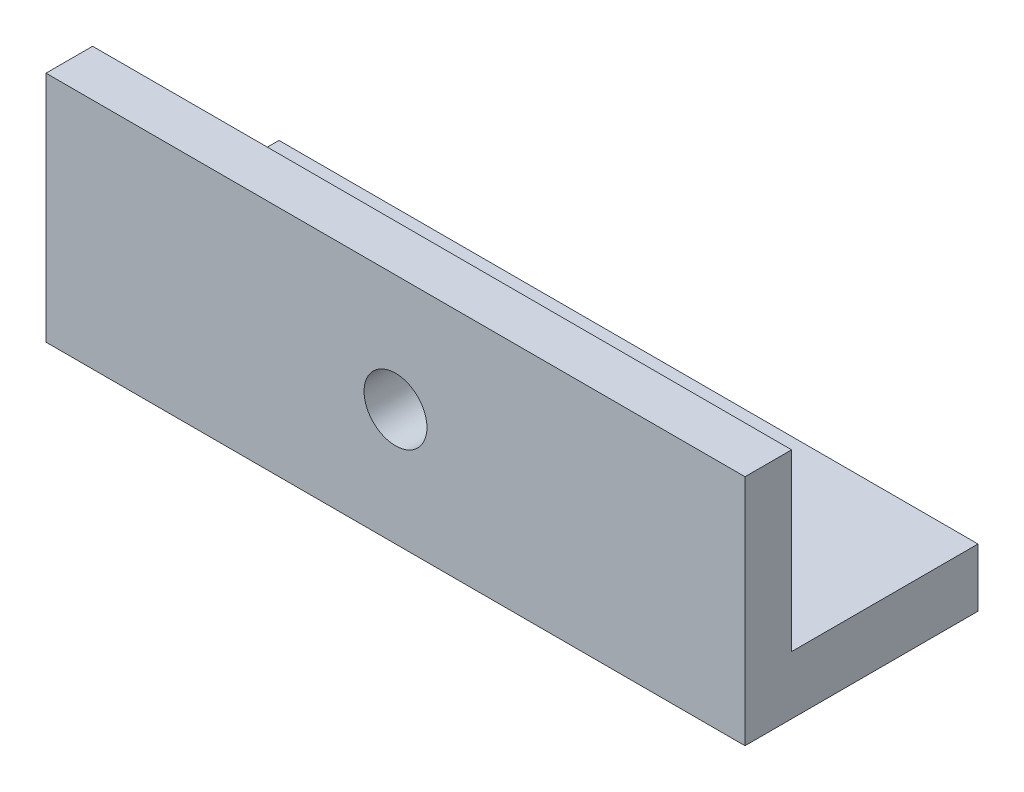
ISO-10303-21;
HEADER;
FILE_DESCRIPTION(('STEP AP214'),'2;1');
FILE_NAME('part.step','',(''),(''),'','','');
FILE_SCHEMA(('AUTOMOTIVE_DESIGN { 1 0 10303 214 1 1 1 1 }'));
ENDSEC;
DATA;
#1=APPLICATION_CONTEXT('core data for automotive mechanical design processes');
#2=APPLICATION_PROTOCOL_DEFINITION('international standard','automotive_design',2000,#1);
#3=PRODUCT_CONTEXT('',#1,'mechanical');
#4=PRODUCT('Part','Part','',(#3));
#5=PRODUCT_RELATED_PRODUCT_CATEGORY('part','',(#4));
#6=PRODUCT_DEFINITION_FORMATION('','',#4);
#7=PRODUCT_DEFINITION_CONTEXT('part definition',#1,'design');
#8=PRODUCT_DEFINITION('design','',#6,#7);
#9=PRODUCT_DEFINITION_SHAPE('','',#8);
#10=(LENGTH_UNIT() NAMED_UNIT(*) SI_UNIT(.MILLI.,.METRE.));
#11=(NAMED_UNIT(*) PLANE_ANGLE_UNIT() SI_UNIT($,.RADIAN.));
#12=(NAMED_UNIT(*) SI_UNIT($,.STERADIAN.) SOLID_ANGLE_UNIT());
#13=UNCERTAINTY_MEASURE_WITH_UNIT(LENGTH_MEASURE(1.E-05),#10,'distance_accuracy_value','');
#14=(GEOMETRIC_REPRESENTATION_CONTEXT(3) GLOBAL_UNCERTAINTY_ASSIGNED_CONTEXT((#13)) GLOBAL_UNIT_ASSIGNED_CONTEXT((#10,
#11,#12)) REPRESENTATION_CONTEXT('',''));
#15=CARTESIAN_POINT('',(0.,0.,0.));
#16=DIRECTION('',(0.,0.,1.));
#17=DIRECTION('',(1.,0.,0.));
#18=AXIS2_PLACEMENT_3D('',#15,#16,#17);
#19=CARTESIAN_POINT('',(0.,6.35,0.));
#20=DIRECTION('',(0.,-1.,0.));
#21=DIRECTION('',(0.,0.,-1.));
#22=AXIS2_PLACEMENT_3D('',#19,#20,#21);
#23=PLANE('',#22);
#24=CARTESIAN_POINT('',(12.7,6.35,-12.7));
#25=DIRECTION('',(0.,1.,0.));
#26=DIRECTION('',(0.,0.,1.));
#27=AXIS2_PLACEMENT_3D('',#24,#25,#26);
#28=CIRCLE('',#27,2.794);
#29=CARTESIAN_POINT('',(12.7,6.35,-9.906));
#30=VERTEX_POINT('',#29);
#31=EDGE_CURVE('E165',#30,#30,#28,.T.);
#32=ORIENTED_EDGE('',*,*,#31,.F.);
#33=EDGE_LOOP('',(#32));
#34=FACE_BOUND('',#33,.T.);
#35=CARTESIAN_POINT('',(63.5,6.35,-12.7));
#36=DIRECTION('',(0.,1.,0.));
#37=DIRECTION('',(0.,0.,1.));
#38=AXIS2_PLACEMENT_3D('',#35,#36,#37);
#39=CIRCLE('',#38,2.79400000000001);
#40=CARTESIAN_POINT('',(63.5,6.35,-9.90599999999999));
#41=VERTEX_POINT('',#40);
#42=EDGE_CURVE('E105',#41,#41,#39,.T.);
#43=ORIENTED_EDGE('',*,*,#42,.F.);
#44=EDGE_LOOP('',(#43));
#45=FACE_BOUND('',#44,.T.);
#46=DIRECTION('',(-1.,0.,0.));
#47=VECTOR('',#46,1.);
#48=CARTESIAN_POINT('',(0.,6.35,-5.08));
#49=LINE('',#48,#47);
#50=CARTESIAN_POINT('',(76.2,6.35,-5.08));
#51=VERTEX_POINT('',#50);
#52=CARTESIAN_POINT('',(0.,6.35,-5.08));
#53=VERTEX_POINT('',#52);
#54=EDGE_CURVE('E55',#51,#53,#49,.T.);
#55=ORIENTED_EDGE('',*,*,#54,.F.);
#56=DIRECTION('',(0.,0.,-1.));
#57=VECTOR('',#56,1.);
#58=CARTESIAN_POINT('',(76.2,6.35,0.));
#59=LINE('',#58,#57);
#60=CARTESIAN_POINT('',(76.2,6.35,-25.4));
#61=VERTEX_POINT('',#60);
#62=EDGE_CURVE('E176',#51,#61,#59,.T.);
#63=ORIENTED_EDGE('',*,*,#62,.T.);
#64=DIRECTION('',(-1.,0.,0.));
#65=VECTOR('',#64,1.);
#66=CARTESIAN_POINT('',(0.,6.35,-25.4));
#67=LINE('',#66,#65);
#68=CARTESIAN_POINT('',(0.,6.35,-25.4));
#69=VERTEX_POINT('',#68);
#70=EDGE_CURVE('E61',#61,#69,#67,.T.);
#71=ORIENTED_EDGE('',*,*,#70,.T.);
#72=DIRECTION('',(0.,0.,1.));
#73=VECTOR('',#72,1.);
#74=CARTESIAN_POINT('',(0.,6.35,0.));
#75=LINE('',#74,#73);
#76=EDGE_CURVE('E91',#69,#53,#75,.T.);
#77=ORIENTED_EDGE('',*,*,#76,.T.);
#78=EDGE_LOOP('',(#55,#63,#71,#77));
#79=FACE_BOUND('',#78,.T.);
#80=ADVANCED_FACE('F39',(#34,#45,#79),#23,.F.);
#81=CARTESIAN_POINT('',(0.,0.,0.));
#82=DIRECTION('',(0.,-1.,0.));
#83=DIRECTION('',(0.,0.,-1.));
#84=AXIS2_PLACEMENT_3D('',#81,#82,#83);
#85=PLANE('',#84);
#86=CARTESIAN_POINT('',(63.5,0.,-12.7));
#87=DIRECTION('',(0.,1.,0.));
#88=DIRECTION('',(0.,0.,1.));
#89=AXIS2_PLACEMENT_3D('',#86,#87,#88);
#90=CIRCLE('',#89,2.79400000000001);
#91=CARTESIAN_POINT('',(63.5,0.,-9.90599999999999));
#92=VERTEX_POINT('',#91);
#93=EDGE_CURVE('E111',#92,#92,#90,.T.);
#94=ORIENTED_EDGE('',*,*,#93,.T.);
#95=EDGE_LOOP('',(#94));
#96=FACE_BOUND('',#95,.T.);
#97=DIRECTION('',(0.,0.,1.));
#98=VECTOR('',#97,1.);
#99=CARTESIAN_POINT('',(0.,0.,0.));
#100=LINE('',#99,#98);
#101=CARTESIAN_POINT('',(0.,0.,-25.4));
#102=VERTEX_POINT('',#101);
#103=CARTESIAN_POINT('',(0.,0.,0.));
#104=VERTEX_POINT('',#103);
#105=EDGE_CURVE('E97',#102,#104,#100,.T.);
#106=ORIENTED_EDGE('',*,*,#105,.F.);
#107=DIRECTION('',(-1.,0.,0.));
#108=VECTOR('',#107,1.);
#109=CARTESIAN_POINT('',(0.,0.,-25.4));
#110=LINE('',#109,#108);
#111=CARTESIAN_POINT('',(76.2,0.,-25.4));
#112=VERTEX_POINT('',#111);
#113=EDGE_CURVE('E80',#112,#102,#110,.T.);
#114=ORIENTED_EDGE('',*,*,#113,.F.);
#115=DIRECTION('',(0.,0.,-1.));
#116=VECTOR('',#115,1.);
#117=CARTESIAN_POINT('',(76.2,0.,0.));
#118=LINE('',#117,#116);
#119=CARTESIAN_POINT('',(76.2,0.,0.));
#120=VERTEX_POINT('',#119);
#121=EDGE_CURVE('E92',#120,#112,#118,.T.);
#122=ORIENTED_EDGE('',*,*,#121,.F.);
#123=DIRECTION('',(1.,0.,0.));
#124=VECTOR('',#123,1.);
#125=CARTESIAN_POINT('',(0.,0.,0.));
#126=LINE('',#125,#124);
#127=EDGE_CURVE('E103',#104,#120,#126,.T.);
#128=ORIENTED_EDGE('',*,*,#127,.F.);
#129=EDGE_LOOP('',(#106,#114,#122,#128));
#130=FACE_BOUND('',#129,.T.);
#131=CARTESIAN_POINT('',(12.7,0.,-12.7));
#132=DIRECTION('',(0.,1.,0.));
#133=DIRECTION('',(0.,0.,1.));
#134=AXIS2_PLACEMENT_3D('',#131,#132,#133);
#135=CIRCLE('',#134,2.794);
#136=CARTESIAN_POINT('',(12.7,0.,-9.906));
#137=VERTEX_POINT('',#136);
#138=EDGE_CURVE('E164',#137,#137,#135,.T.);
#139=ORIENTED_EDGE('',*,*,#138,.T.);
#140=EDGE_LOOP('',(#139));
#141=FACE_BOUND('',#140,.T.);
#142=ADVANCED_FACE('F101',(#96,#130,#141),#85,.T.);
#143=CARTESIAN_POINT('',(0.,6.35,0.));
#144=DIRECTION('',(1.,0.,0.));
#145=DIRECTION('',(0.,0.,-1.));
#146=AXIS2_PLACEMENT_3D('',#143,#144,#145);
#147=PLANE('',#146);
#148=ORIENTED_EDGE('',*,*,#105,.T.);
#149=DIRECTION('',(0.,-1.,0.));
#150=VECTOR('',#149,1.);
#151=CARTESIAN_POINT('',(0.,6.35,0.));
#152=LINE('',#151,#150);
#153=CARTESIAN_POINT('',(0.,25.4,0.));
#154=VERTEX_POINT('',#153);
#155=EDGE_CURVE('E11',#154,#104,#152,.T.);
#156=ORIENTED_EDGE('',*,*,#155,.F.);
#157=DIRECTION('',(0.,0.,1.));
#158=VECTOR('',#157,1.);
#159=CARTESIAN_POINT('',(0.,25.4,0.));
#160=LINE('',#159,#158);
#161=CARTESIAN_POINT('',(0.,25.4,-5.08));
#162=VERTEX_POINT('',#161);
#163=EDGE_CURVE('E142',#162,#154,#160,.T.);
#164=ORIENTED_EDGE('',*,*,#163,.F.);
#165=DIRECTION('',(0.,-1.,0.));
#166=VECTOR('',#165,1.);
#167=CARTESIAN_POINT('',(0.,25.4,-5.08));
#168=LINE('',#167,#166);
#169=EDGE_CURVE('E154',#162,#53,#168,.T.);
#170=ORIENTED_EDGE('',*,*,#169,.T.);
#171=ORIENTED_EDGE('',*,*,#76,.F.);
#172=DIRECTION('',(0.,-1.,0.));
#173=VECTOR('',#172,1.);
#174=CARTESIAN_POINT('',(0.,6.35,-25.4));
#175=LINE('',#174,#173);
#176=EDGE_CURVE('E83',#69,#102,#175,.T.);
#177=ORIENTED_EDGE('',*,*,#176,.T.);
#178=EDGE_LOOP('',(#148,#156,#164,#170,#171,#177));
#179=FACE_BOUND('',#178,.T.);
#180=ADVANCED_FACE('F41',(#179),#147,.F.);
#181=CARTESIAN_POINT('',(0.,6.35,0.));
#182=DIRECTION('',(0.,0.,-1.));
#183=DIRECTION('',(-1.,0.,0.));
#184=AXIS2_PLACEMENT_3D('',#181,#182,#183);
#185=PLANE('',#184);
#186=CARTESIAN_POINT('',(38.1,12.7,0.));
#187=DIRECTION('',(0.,0.,1.));
#188=DIRECTION('',(1.,0.,0.));
#189=AXIS2_PLACEMENT_3D('',#186,#187,#188);
#190=CIRCLE('',#189,3.429);
#191=CARTESIAN_POINT('',(41.529,12.7,0.));
#192=VERTEX_POINT('',#191);
#193=EDGE_CURVE('E225',#192,#192,#190,.T.);
#194=ORIENTED_EDGE('',*,*,#193,.F.);
#195=EDGE_LOOP('',(#194));
#196=FACE_BOUND('',#195,.T.);
#197=ORIENTED_EDGE('',*,*,#127,.T.);
#198=DIRECTION('',(0.,-1.,0.));
#199=VECTOR('',#198,1.);
#200=CARTESIAN_POINT('',(76.2,6.35,0.));
#201=LINE('',#200,#199);
#202=CARTESIAN_POINT('',(76.2,25.4,0.));
#203=VERTEX_POINT('',#202);
#204=EDGE_CURVE('E48',#203,#120,#201,.T.);
#205=ORIENTED_EDGE('',*,*,#204,.F.);
#206=DIRECTION('',(1.,0.,0.));
#207=VECTOR('',#206,1.);
#208=CARTESIAN_POINT('',(0.,25.4,0.));
#209=LINE('',#208,#207);
#210=EDGE_CURVE('E134',#154,#203,#209,.T.);
#211=ORIENTED_EDGE('',*,*,#210,.F.);
#212=ORIENTED_EDGE('',*,*,#155,.T.);
#213=EDGE_LOOP('',(#197,#205,#211,#212));
#214=FACE_BOUND('',#213,.T.);
#215=ADVANCED_FACE('F132',(#196,#214),#185,.F.);
#216=CARTESIAN_POINT('',(76.2,6.35,0.));
#217=DIRECTION('',(-1.,0.,0.));
#218=DIRECTION('',(0.,0.,1.));
#219=AXIS2_PLACEMENT_3D('',#216,#217,#218);
#220=PLANE('',#219);
#221=ORIENTED_EDGE('',*,*,#121,.T.);
#222=DIRECTION('',(0.,-1.,0.));
#223=VECTOR('',#222,1.);
#224=CARTESIAN_POINT('',(76.2,6.35,-25.4));
#225=LINE('',#224,#223);
#226=EDGE_CURVE('E86',#61,#112,#225,.T.);
#227=ORIENTED_EDGE('',*,*,#226,.F.);
#228=ORIENTED_EDGE('',*,*,#62,.F.);
#229=DIRECTION('',(0.,-1.,0.));
#230=VECTOR('',#229,1.);
#231=CARTESIAN_POINT('',(76.2,25.4,-5.08));
#232=LINE('',#231,#230);
#233=CARTESIAN_POINT('',(76.2,25.4,-5.08));
#234=VERTEX_POINT('',#233);
#235=EDGE_CURVE('E160',#234,#51,#232,.T.);
#236=ORIENTED_EDGE('',*,*,#235,.F.);
#237=DIRECTION('',(0.,0.,-1.));
#238=VECTOR('',#237,1.);
#239=CARTESIAN_POINT('',(76.2,25.4,0.));
#240=LINE('',#239,#238);
#241=EDGE_CURVE('E128',#203,#234,#240,.T.);
#242=ORIENTED_EDGE('',*,*,#241,.F.);
#243=ORIENTED_EDGE('',*,*,#204,.T.);
#244=EDGE_LOOP('',(#221,#227,#228,#236,#242,#243));
#245=FACE_BOUND('',#244,.T.);
#246=ADVANCED_FACE('F124',(#245),#220,.F.);
#247=CARTESIAN_POINT('',(0.,6.35,-25.4));
#248=DIRECTION('',(0.,0.,1.));
#249=DIRECTION('',(1.,0.,0.));
#250=AXIS2_PLACEMENT_3D('',#247,#248,#249);
#251=PLANE('',#250);
#252=ORIENTED_EDGE('',*,*,#113,.T.);
#253=ORIENTED_EDGE('',*,*,#176,.F.);
#254=ORIENTED_EDGE('',*,*,#70,.F.);
#255=ORIENTED_EDGE('',*,*,#226,.T.);
#256=EDGE_LOOP('',(#252,#253,#254,#255));
#257=FACE_BOUND('',#256,.T.);
#258=ADVANCED_FACE('F82',(#257),#251,.F.);
#259=CARTESIAN_POINT('',(63.5,6.35,-12.7));
#260=DIRECTION('',(0.,-1.,0.));
#261=DIRECTION('',(0.,0.,-1.));
#262=AXIS2_PLACEMENT_3D('',#259,#260,#261);
#263=CYLINDRICAL_SURFACE('',#262,2.79400000000001);
#264=ORIENTED_EDGE('',*,*,#42,.T.);
#265=EDGE_LOOP('',(#264));
#266=FACE_BOUND('',#265,.T.);
#267=ORIENTED_EDGE('',*,*,#93,.F.);
#268=EDGE_LOOP('',(#267));
#269=FACE_BOUND('',#268,.T.);
#270=ADVANCED_FACE('F198',(#266,#269),#263,.F.);
#271=CARTESIAN_POINT('',(12.7,6.35,-12.7));
#272=DIRECTION('',(0.,-1.,0.));
#273=DIRECTION('',(0.,0.,-1.));
#274=AXIS2_PLACEMENT_3D('',#271,#272,#273);
#275=CYLINDRICAL_SURFACE('',#274,2.794);
#276=ORIENTED_EDGE('',*,*,#31,.T.);
#277=EDGE_LOOP('',(#276));
#278=FACE_BOUND('',#277,.T.);
#279=ORIENTED_EDGE('',*,*,#138,.F.);
#280=EDGE_LOOP('',(#279));
#281=FACE_BOUND('',#280,.T.);
#282=ADVANCED_FACE('F188',(#278,#281),#275,.F.);
#283=CARTESIAN_POINT('',(0.,25.4,-5.08));
#284=DIRECTION('',(0.,0.,1.));
#285=DIRECTION('',(1.,0.,0.));
#286=AXIS2_PLACEMENT_3D('',#283,#284,#285);
#287=PLANE('',#286);
#288=CARTESIAN_POINT('',(38.1,12.7,-5.08));
#289=DIRECTION('',(0.,0.,1.));
#290=DIRECTION('',(1.,0.,0.));
#291=AXIS2_PLACEMENT_3D('',#288,#289,#290);
#292=CIRCLE('',#291,3.429);
#293=CARTESIAN_POINT('',(41.529,12.7,-5.08));
#294=VERTEX_POINT('',#293);
#295=EDGE_CURVE('E157',#294,#294,#292,.F.);
#296=ORIENTED_EDGE('',*,*,#295,.F.);
#297=EDGE_LOOP('',(#296));
#298=FACE_BOUND('',#297,.T.);
#299=ORIENTED_EDGE('',*,*,#54,.T.);
#300=ORIENTED_EDGE('',*,*,#169,.F.);
#301=DIRECTION('',(-1.,0.,0.));
#302=VECTOR('',#301,1.);
#303=CARTESIAN_POINT('',(0.,25.4,-5.08));
#304=LINE('',#303,#302);
#305=EDGE_CURVE('E147',#234,#162,#304,.T.);
#306=ORIENTED_EDGE('',*,*,#305,.F.);
#307=ORIENTED_EDGE('',*,*,#235,.T.);
#308=EDGE_LOOP('',(#299,#300,#306,#307));
#309=FACE_BOUND('',#308,.T.);
#310=ADVANCED_FACE('F181',(#298,#309),#287,.F.);
#311=CARTESIAN_POINT('',(0.,25.4,0.));
#312=DIRECTION('',(0.,-1.,0.));
#313=DIRECTION('',(0.,0.,-1.));
#314=AXIS2_PLACEMENT_3D('',#311,#312,#313);
#315=PLANE('',#314);
#316=ORIENTED_EDGE('',*,*,#163,.T.);
#317=ORIENTED_EDGE('',*,*,#210,.T.);
#318=ORIENTED_EDGE('',*,*,#241,.T.);
#319=ORIENTED_EDGE('',*,*,#305,.T.);
#320=EDGE_LOOP('',(#316,#317,#318,#319));
#321=FACE_BOUND('',#320,.T.);
#322=ADVANCED_FACE('F139',(#321),#315,.F.);
#323=CARTESIAN_POINT('',(38.1,12.7,-14.7786766107547));
#324=DIRECTION('',(0.,0.,1.));
#325=DIRECTION('',(1.,0.,0.));
#326=AXIS2_PLACEMENT_3D('',#323,#324,#325);
#327=CYLINDRICAL_SURFACE('',#326,3.429);
#328=CARTESIAN_POINT('',(41.529,12.7,-5.08));
#329=CARTESIAN_POINT('',(41.529,12.7,-5.02708333333334));
#330=CARTESIAN_POINT('',(41.529,12.7,-4.97416666666667));
#331=CARTESIAN_POINT('',(41.529,12.7,-4.86833333333334));
#332=CARTESIAN_POINT('',(41.529,12.7,-4.81541666666667));
#333=CARTESIAN_POINT('',(41.529,12.7,-4.70958333333334));
#334=CARTESIAN_POINT('',(41.529,12.7,-4.65666666666667));
#335=CARTESIAN_POINT('',(41.529,12.7,-4.55083333333334));
#336=CARTESIAN_POINT('',(41.529,12.7,-4.49791666666667));
#337=CARTESIAN_POINT('',(41.529,12.7,-4.39208333333334));
#338=CARTESIAN_POINT('',(41.529,12.7,-4.33916666666667));
#339=CARTESIAN_POINT('',(41.529,12.7,-4.23333333333334));
#340=CARTESIAN_POINT('',(41.529,12.7,-4.18041666666667));
#341=CARTESIAN_POINT('',(41.529,12.7,-4.07458333333334));
#342=CARTESIAN_POINT('',(41.529,12.7,-4.02166666666667));
#343=CARTESIAN_POINT('',(41.529,12.7,-3.91583333333334));
#344=CARTESIAN_POINT('',(41.529,12.7,-3.86291666666667));
#345=CARTESIAN_POINT('',(41.529,12.7,-3.75708333333334));
#346=CARTESIAN_POINT('',(41.529,12.7,-3.70416666666667));
#347=CARTESIAN_POINT('',(41.529,12.7,-3.59833333333334));
#348=CARTESIAN_POINT('',(41.529,12.7,-3.54541666666667));
#349=CARTESIAN_POINT('',(41.529,12.7,-3.43958333333334));
#350=CARTESIAN_POINT('',(41.529,12.7,-3.38666666666667));
#351=CARTESIAN_POINT('',(41.529,12.7,-3.28083333333334));
#352=CARTESIAN_POINT('',(41.529,12.7,-3.22791666666667));
#353=CARTESIAN_POINT('',(41.529,12.7,-3.12208333333334));
#354=CARTESIAN_POINT('',(41.529,12.7,-3.06916666666667));
#355=CARTESIAN_POINT('',(41.529,12.7,-2.96333333333334));
#356=CARTESIAN_POINT('',(41.529,12.7,-2.91041666666667));
#357=CARTESIAN_POINT('',(41.529,12.7,-2.80458333333334));
#358=CARTESIAN_POINT('',(41.529,12.7,-2.75166666666667));
#359=CARTESIAN_POINT('',(41.529,12.7,-2.64583333333334));
#360=CARTESIAN_POINT('',(41.529,12.7,-2.59291666666667));
#361=CARTESIAN_POINT('',(41.529,12.7,-2.48708333333334));
#362=CARTESIAN_POINT('',(41.529,12.7,-2.43416666666667));
#363=CARTESIAN_POINT('',(41.529,12.7,-2.32833333333334));
#364=CARTESIAN_POINT('',(41.529,12.7,-2.27541666666667));
#365=CARTESIAN_POINT('',(41.529,12.7,-2.16958333333334));
#366=CARTESIAN_POINT('',(41.529,12.7,-2.11666666666667));
#367=CARTESIAN_POINT('',(41.529,12.7,-2.01083333333334));
#368=CARTESIAN_POINT('',(41.529,12.7,-1.95791666666667));
#369=CARTESIAN_POINT('',(41.529,12.7,-1.85208333333334));
#370=CARTESIAN_POINT('',(41.529,12.7,-1.79916666666667));
#371=CARTESIAN_POINT('',(41.529,12.7,-1.69333333333334));
#372=CARTESIAN_POINT('',(41.529,12.7,-1.64041666666667));
#373=CARTESIAN_POINT('',(41.529,12.7,-1.53458333333333));
#374=CARTESIAN_POINT('',(41.529,12.7,-1.48166666666667));
#375=CARTESIAN_POINT('',(41.529,12.7,-1.37583333333333));
#376=CARTESIAN_POINT('',(41.529,12.7,-1.32291666666667));
#377=CARTESIAN_POINT('',(41.529,12.7,-1.21708333333334));
#378=CARTESIAN_POINT('',(41.529,12.7,-1.16416666666667));
#379=CARTESIAN_POINT('',(41.529,12.7,-1.05833333333334));
#380=CARTESIAN_POINT('',(41.529,12.7,-1.00541666666667));
#381=CARTESIAN_POINT('',(41.529,12.7,-0.899583333333335));
#382=CARTESIAN_POINT('',(41.529,12.7,-0.846666666666668));
#383=CARTESIAN_POINT('',(41.529,12.7,-0.740833333333335));
#384=CARTESIAN_POINT('',(41.529,12.7,-0.687916666666668));
#385=CARTESIAN_POINT('',(41.529,12.7,-0.582083333333336));
#386=CARTESIAN_POINT('',(41.529,12.7,-0.529166666666669));
#387=CARTESIAN_POINT('',(41.529,12.7,-0.423333333333336));
#388=CARTESIAN_POINT('',(41.529,12.7,-0.370416666666669));
#389=CARTESIAN_POINT('',(41.529,12.7,-0.264583333333335));
#390=CARTESIAN_POINT('',(41.529,12.7,-0.211666666666668));
#391=CARTESIAN_POINT('',(41.529,12.7,-0.105833333333335));
#392=CARTESIAN_POINT('',(41.529,12.7,-0.0529166666666681));
#393=CARTESIAN_POINT('',(41.529,12.7,0.));
#394=B_SPLINE_CURVE_WITH_KNOTS('',3,(#328,#329,#330,#331,#332,#333,#334,#335,#336,#337,#338,
#339,#340,#341,#342,#343,#344,#345,#346,#347,#348,#349,#350,#351,#352,#353,#354,#355,#356,#357,
#358,#359,#360,#361,#362,#363,#364,#365,#366,#367,#368,#369,#370,#371,#372,#373,#374,#375,#376,
#377,#378,#379,#380,#381,#382,#383,#384,#385,#386,#387,#388,#389,#390,#391,#392,#393),
.UNSPECIFIED.,.F.,.F.,(4,2,2,2,2,2,2,2,2,2,2,2,2,2,2,2,2,2,2,2,2,2,2,2,2,2,2,2,2,2,2,2,4),(0.,
0.158749999999999,0.3175,0.476250000000001,0.635,0.793749999999999,0.9525,1.11125,1.27,1.42875,
1.5875,1.74625,1.905,2.06375,2.2225,2.38125,2.54,2.69875,2.8575,3.01625,3.175,3.33375,3.4925,
3.65125,3.81,3.96875,4.1275,4.28625,4.445,4.60375,4.7625,4.92125,5.08),.UNSPECIFIED.);
#395=EDGE_CURVE('BSEAM195',#294,#192,#394,.T.);
#396=ORIENTED_EDGE('',*,*,#295,.T.);
#397=ORIENTED_EDGE('',*,*,#193,.T.);
#398=ORIENTED_EDGE('',*,*,#395,.T.);
#399=ORIENTED_EDGE('',*,*,#395,.F.);
#400=EDGE_LOOP('',(#396,#398,#397,#399));
#401=FACE_BOUND('',#400,.T.);
#402=ADVANCED_FACE('F195',(#401),#327,.F.);
#403=CLOSED_SHELL('',(#80,#142,#180,#215,#246,#258,#270,#282,#310,#322,#402));
#404=MANIFOLD_SOLID_BREP('B2',#403);
#405=ADVANCED_BREP_SHAPE_REPRESENTATION('',(#18,#404),#14);
#406=SHAPE_DEFINITION_REPRESENTATION(#9,#405);
ENDSEC;
END-ISO-10303-21;
